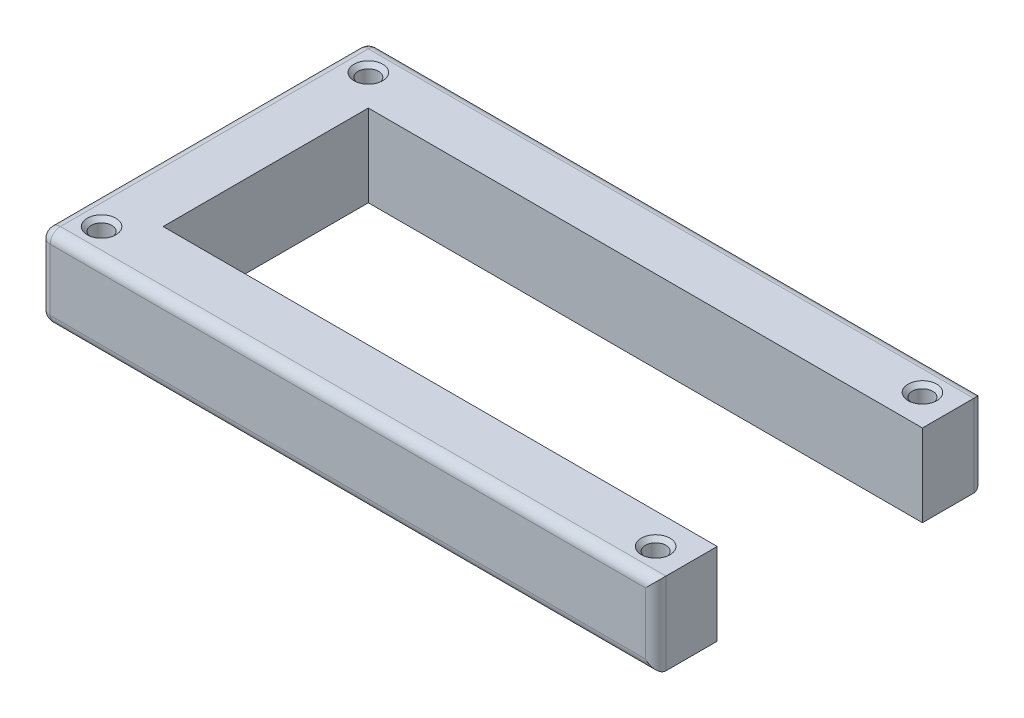
ISO-10303-21;
HEADER;
FILE_DESCRIPTION(('STEP AP214'),'2;1');
FILE_NAME('part.step','',(''),(''),'','','');
FILE_SCHEMA(('AUTOMOTIVE_DESIGN { 1 0 10303 214 1 1 1 1 }'));
ENDSEC;
DATA;
#1=APPLICATION_CONTEXT('core data for automotive mechanical design processes');
#2=APPLICATION_PROTOCOL_DEFINITION('international standard','automotive_design',2000,#1);
#3=PRODUCT_CONTEXT('',#1,'mechanical');
#4=PRODUCT('Part','Part','',(#3));
#5=PRODUCT_RELATED_PRODUCT_CATEGORY('part','',(#4));
#6=PRODUCT_DEFINITION_FORMATION('','',#4);
#7=PRODUCT_DEFINITION_CONTEXT('part definition',#1,'design');
#8=PRODUCT_DEFINITION('design','',#6,#7);
#9=PRODUCT_DEFINITION_SHAPE('','',#8);
#10=(LENGTH_UNIT() NAMED_UNIT(*) SI_UNIT(.MILLI.,.METRE.));
#11=(NAMED_UNIT(*) PLANE_ANGLE_UNIT() SI_UNIT($,.RADIAN.));
#12=(NAMED_UNIT(*) SI_UNIT($,.STERADIAN.) SOLID_ANGLE_UNIT());
#13=UNCERTAINTY_MEASURE_WITH_UNIT(LENGTH_MEASURE(1.E-05),#10,'distance_accuracy_value','');
#14=(GEOMETRIC_REPRESENTATION_CONTEXT(3) GLOBAL_UNCERTAINTY_ASSIGNED_CONTEXT((#13)) GLOBAL_UNIT_ASSIGNED_CONTEXT((#10,
#11,#12)) REPRESENTATION_CONTEXT('',''));
#15=CARTESIAN_POINT('',(0.,0.,0.));
#16=DIRECTION('',(0.,0.,1.));
#17=DIRECTION('',(1.,0.,0.));
#18=AXIS2_PLACEMENT_3D('',#15,#16,#17);
#19=CARTESIAN_POINT('',(0.,20.,0.));
#20=DIRECTION('',(0.,1.,0.));
#21=DIRECTION('',(0.,0.,1.));
#22=AXIS2_PLACEMENT_3D('',#19,#20,#21);
#23=PLANE('',#22);
#24=CARTESIAN_POINT('',(67.5,20.,-32.5));
#25=DIRECTION('',(0.,1.,0.));
#26=DIRECTION('',(0.,0.,1.));
#27=AXIS2_PLACEMENT_3D('',#24,#25,#26);
#28=CIRCLE('',#27,3.49999999999999);
#29=CARTESIAN_POINT('',(67.5,20.,-29.));
#30=VERTEX_POINT('',#29);
#31=EDGE_CURVE('E344',#30,#30,#28,.F.);
#32=ORIENTED_EDGE('',*,*,#31,.T.);
#33=EDGE_LOOP('',(#32));
#34=FACE_BOUND('',#33,.T.);
#35=CARTESIAN_POINT('',(-67.5,20.,-32.5));
#36=DIRECTION('',(0.,1.,0.));
#37=DIRECTION('',(0.,0.,1.));
#38=AXIS2_PLACEMENT_3D('',#35,#36,#37);
#39=CIRCLE('',#38,3.49999999999999);
#40=CARTESIAN_POINT('',(-67.5,20.,-29.));
#41=VERTEX_POINT('',#40);
#42=EDGE_CURVE('E340',#41,#41,#39,.F.);
#43=ORIENTED_EDGE('',*,*,#42,.T.);
#44=EDGE_LOOP('',(#43));
#45=FACE_BOUND('',#44,.T.);
#46=CARTESIAN_POINT('',(-67.5,20.,32.5));
#47=DIRECTION('',(0.,1.,0.));
#48=DIRECTION('',(0.,0.,1.));
#49=AXIS2_PLACEMENT_3D('',#46,#47,#48);
#50=CIRCLE('',#49,3.49999999999999);
#51=CARTESIAN_POINT('',(-67.5,20.,36.));
#52=VERTEX_POINT('',#51);
#53=EDGE_CURVE('E336',#52,#52,#50,.F.);
#54=ORIENTED_EDGE('',*,*,#53,.T.);
#55=EDGE_LOOP('',(#54));
#56=FACE_BOUND('',#55,.T.);
#57=CARTESIAN_POINT('',(67.5,20.,32.5));
#58=DIRECTION('',(0.,1.,0.));
#59=DIRECTION('',(0.,0.,1.));
#60=AXIS2_PLACEMENT_3D('',#57,#58,#59);
#61=CIRCLE('',#60,3.49999999999999);
#62=CARTESIAN_POINT('',(67.5,20.,36.));
#63=VERTEX_POINT('',#62);
#64=EDGE_CURVE('E332',#63,#63,#61,.F.);
#65=ORIENTED_EDGE('',*,*,#64,.T.);
#66=EDGE_LOOP('',(#65));
#67=FACE_BOUND('',#66,.T.);
#68=DIRECTION('',(0.,0.,-1.));
#69=VECTOR('',#68,1.);
#70=CARTESIAN_POINT('',(75.,20.,-25.));
#71=LINE('',#70,#69);
#72=CARTESIAN_POINT('',(75.,20.,-25.));
#73=VERTEX_POINT('',#72);
#74=CARTESIAN_POINT('',(75.,20.,-37.5));
#75=VERTEX_POINT('',#74);
#76=EDGE_CURVE('E179',#73,#75,#71,.T.);
#77=ORIENTED_EDGE('',*,*,#76,.T.);
#78=DIRECTION('',(-1.,0.,0.));
#79=VECTOR('',#78,1.);
#80=CARTESIAN_POINT('',(-75.,20.,-37.5));
#81=LINE('',#80,#79);
#82=CARTESIAN_POINT('',(-72.5,20.,-37.5));
#83=VERTEX_POINT('',#82);
#84=EDGE_CURVE('E250',#75,#83,#81,.T.);
#85=ORIENTED_EDGE('',*,*,#84,.T.);
#86=DIRECTION('',(0.,0.,1.));
#87=VECTOR('',#86,1.);
#88=CARTESIAN_POINT('',(-72.5,20.,40.));
#89=LINE('',#88,#87);
#90=CARTESIAN_POINT('',(-72.5,20.,37.5));
#91=VERTEX_POINT('',#90);
#92=EDGE_CURVE('E247',#83,#91,#89,.T.);
#93=ORIENTED_EDGE('',*,*,#92,.T.);
#94=DIRECTION('',(1.,0.,0.));
#95=VECTOR('',#94,1.);
#96=CARTESIAN_POINT('',(75.,20.,37.5));
#97=LINE('',#96,#95);
#98=CARTESIAN_POINT('',(75.,20.,37.5));
#99=VERTEX_POINT('',#98);
#100=EDGE_CURVE('E149',#91,#99,#97,.T.);
#101=ORIENTED_EDGE('',*,*,#100,.T.);
#102=DIRECTION('',(0.,0.,-1.));
#103=VECTOR('',#102,1.);
#104=CARTESIAN_POINT('',(75.,20.,40.));
#105=LINE('',#104,#103);
#106=CARTESIAN_POINT('',(75.,20.,25.));
#107=VERTEX_POINT('',#106);
#108=EDGE_CURVE('E142',#99,#107,#105,.T.);
#109=ORIENTED_EDGE('',*,*,#108,.T.);
#110=DIRECTION('',(-1.,0.,0.));
#111=VECTOR('',#110,1.);
#112=CARTESIAN_POINT('',(75.,20.,25.));
#113=LINE('',#112,#111);
#114=CARTESIAN_POINT('',(-60.,20.,25.));
#115=VERTEX_POINT('',#114);
#116=EDGE_CURVE('E146',#107,#115,#113,.T.);
#117=ORIENTED_EDGE('',*,*,#116,.T.);
#118=DIRECTION('',(0.,0.,-1.));
#119=VECTOR('',#118,1.);
#120=CARTESIAN_POINT('',(-60.,20.,-25.));
#121=LINE('',#120,#119);
#122=CARTESIAN_POINT('',(-60.,20.,-25.));
#123=VERTEX_POINT('',#122);
#124=EDGE_CURVE('E170',#115,#123,#121,.T.);
#125=ORIENTED_EDGE('',*,*,#124,.T.);
#126=DIRECTION('',(1.,0.,0.));
#127=VECTOR('',#126,1.);
#128=CARTESIAN_POINT('',(75.,20.,-25.));
#129=LINE('',#128,#127);
#130=EDGE_CURVE('E173',#123,#73,#129,.T.);
#131=ORIENTED_EDGE('',*,*,#130,.T.);
#132=EDGE_LOOP('',(#77,#85,#93,#101,#109,#117,#125,#131));
#133=FACE_BOUND('',#132,.T.);
#134=ADVANCED_FACE('F41',(#34,#45,#56,#67,#133),#23,.T.);
#135=CARTESIAN_POINT('',(0.,0.,0.));
#136=DIRECTION('',(0.,1.,0.));
#137=DIRECTION('',(0.,0.,1.));
#138=AXIS2_PLACEMENT_3D('',#135,#136,#137);
#139=PLANE('',#138);
#140=DIRECTION('',(0.,0.,1.));
#141=VECTOR('',#140,1.);
#142=CARTESIAN_POINT('',(-72.5,0.,0.));
#143=LINE('',#142,#141);
#144=CARTESIAN_POINT('',(-72.5,0.,37.5));
#145=VERTEX_POINT('',#144);
#146=CARTESIAN_POINT('',(-72.5,0.,-37.5));
#147=VERTEX_POINT('',#146);
#148=EDGE_CURVE('E236',#145,#147,#143,.F.);
#149=ORIENTED_EDGE('',*,*,#148,.T.);
#150=DIRECTION('',(-1.,0.,0.));
#151=VECTOR('',#150,1.);
#152=CARTESIAN_POINT('',(0.,0.,-37.5));
#153=LINE('',#152,#151);
#154=CARTESIAN_POINT('',(75.,0.,-37.5));
#155=VERTEX_POINT('',#154);
#156=EDGE_CURVE('E242',#147,#155,#153,.F.);
#157=ORIENTED_EDGE('',*,*,#156,.T.);
#158=DIRECTION('',(0.,0.,-1.));
#159=VECTOR('',#158,1.);
#160=CARTESIAN_POINT('',(75.,0.,-25.));
#161=LINE('',#160,#159);
#162=CARTESIAN_POINT('',(75.,0.,-25.));
#163=VERTEX_POINT('',#162);
#164=EDGE_CURVE('E153',#163,#155,#161,.T.);
#165=ORIENTED_EDGE('',*,*,#164,.F.);
#166=DIRECTION('',(1.,0.,0.));
#167=VECTOR('',#166,1.);
#168=CARTESIAN_POINT('',(75.,0.,-25.));
#169=LINE('',#168,#167);
#170=CARTESIAN_POINT('',(-60.,0.,-25.));
#171=VERTEX_POINT('',#170);
#172=EDGE_CURVE('E192',#171,#163,#169,.T.);
#173=ORIENTED_EDGE('',*,*,#172,.F.);
#174=DIRECTION('',(0.,0.,-1.));
#175=VECTOR('',#174,1.);
#176=CARTESIAN_POINT('',(-60.,0.,-25.));
#177=LINE('',#176,#175);
#178=CARTESIAN_POINT('',(-60.,0.,25.));
#179=VERTEX_POINT('',#178);
#180=EDGE_CURVE('E189',#179,#171,#177,.T.);
#181=ORIENTED_EDGE('',*,*,#180,.F.);
#182=DIRECTION('',(-1.,0.,0.));
#183=VECTOR('',#182,1.);
#184=CARTESIAN_POINT('',(75.,0.,25.));
#185=LINE('',#184,#183);
#186=CARTESIAN_POINT('',(75.,0.,25.));
#187=VERTEX_POINT('',#186);
#188=EDGE_CURVE('E185',#187,#179,#185,.T.);
#189=ORIENTED_EDGE('',*,*,#188,.F.);
#190=DIRECTION('',(0.,0.,-1.));
#191=VECTOR('',#190,1.);
#192=CARTESIAN_POINT('',(75.,0.,40.));
#193=LINE('',#192,#191);
#194=CARTESIAN_POINT('',(75.,0.,37.5));
#195=VERTEX_POINT('',#194);
#196=EDGE_CURVE('E159',#195,#187,#193,.T.);
#197=ORIENTED_EDGE('',*,*,#196,.F.);
#198=DIRECTION('',(1.,0.,0.));
#199=VECTOR('',#198,1.);
#200=CARTESIAN_POINT('',(0.,0.,37.5));
#201=LINE('',#200,#199);
#202=EDGE_CURVE('E239',#195,#145,#201,.F.);
#203=ORIENTED_EDGE('',*,*,#202,.T.);
#204=EDGE_LOOP('',(#149,#157,#165,#173,#181,#189,#197,#203));
#205=FACE_BOUND('',#204,.T.);
#206=CARTESIAN_POINT('',(-67.5,0.,-32.5));
#207=DIRECTION('',(0.,1.,0.));
#208=DIRECTION('',(0.,0.,1.));
#209=AXIS2_PLACEMENT_3D('',#206,#207,#208);
#210=CIRCLE('',#209,2.5);
#211=CARTESIAN_POINT('',(-67.5,0.,-30.));
#212=VERTEX_POINT('',#211);
#213=EDGE_CURVE('E186',#212,#212,#210,.T.);
#214=ORIENTED_EDGE('',*,*,#213,.T.);
#215=EDGE_LOOP('',(#214));
#216=FACE_BOUND('',#215,.T.);
#217=CARTESIAN_POINT('',(67.5,0.,-32.5));
#218=DIRECTION('',(0.,1.,0.));
#219=DIRECTION('',(0.,0.,1.));
#220=AXIS2_PLACEMENT_3D('',#217,#218,#219);
#221=CIRCLE('',#220,2.5);
#222=CARTESIAN_POINT('',(67.5,0.,-30.));
#223=VERTEX_POINT('',#222);
#224=EDGE_CURVE('E493',#223,#223,#221,.T.);
#225=ORIENTED_EDGE('',*,*,#224,.T.);
#226=EDGE_LOOP('',(#225));
#227=FACE_BOUND('',#226,.T.);
#228=CARTESIAN_POINT('',(67.5,0.,32.5));
#229=DIRECTION('',(0.,1.,0.));
#230=DIRECTION('',(0.,0.,1.));
#231=AXIS2_PLACEMENT_3D('',#228,#229,#230);
#232=CIRCLE('',#231,2.5);
#233=CARTESIAN_POINT('',(67.5,0.,35.));
#234=VERTEX_POINT('',#233);
#235=EDGE_CURVE('E496',#234,#234,#232,.T.);
#236=ORIENTED_EDGE('',*,*,#235,.T.);
#237=EDGE_LOOP('',(#236));
#238=FACE_BOUND('',#237,.T.);
#239=CARTESIAN_POINT('',(-67.5,0.,32.5));
#240=DIRECTION('',(0.,1.,0.));
#241=DIRECTION('',(0.,0.,1.));
#242=AXIS2_PLACEMENT_3D('',#239,#240,#241);
#243=CIRCLE('',#242,2.5);
#244=CARTESIAN_POINT('',(-67.5,0.,35.));
#245=VERTEX_POINT('',#244);
#246=EDGE_CURVE('E328',#245,#245,#243,.T.);
#247=ORIENTED_EDGE('',*,*,#246,.T.);
#248=EDGE_LOOP('',(#247));
#249=FACE_BOUND('',#248,.T.);
#250=ADVANCED_FACE('F373',(#205,#216,#227,#238,#249),#139,.F.);
#251=CARTESIAN_POINT('',(-75.,20.,40.));
#252=DIRECTION('',(1.,0.,0.));
#253=DIRECTION('',(0.,0.,-1.));
#254=AXIS2_PLACEMENT_3D('',#251,#252,#253);
#255=PLANE('',#254);
#256=DIRECTION('',(0.,0.,1.));
#257=VECTOR('',#256,1.);
#258=CARTESIAN_POINT('',(-75.,17.5,-40.));
#259=LINE('',#258,#257);
#260=CARTESIAN_POINT('',(-75.,17.5,37.5));
#261=VERTEX_POINT('',#260);
#262=CARTESIAN_POINT('',(-75.,17.5,-37.5));
#263=VERTEX_POINT('',#262);
#264=EDGE_CURVE('E223',#261,#263,#259,.F.);
#265=ORIENTED_EDGE('',*,*,#264,.T.);
#266=DIRECTION('',(0.,-1.,0.));
#267=VECTOR('',#266,1.);
#268=CARTESIAN_POINT('',(-75.,20.,-37.5));
#269=LINE('',#268,#267);
#270=CARTESIAN_POINT('',(-75.,2.5,-37.5));
#271=VERTEX_POINT('',#270);
#272=EDGE_CURVE('E232',#263,#271,#269,.T.);
#273=ORIENTED_EDGE('',*,*,#272,.T.);
#274=DIRECTION('',(0.,0.,1.));
#275=VECTOR('',#274,1.);
#276=CARTESIAN_POINT('',(-75.,2.5,40.));
#277=LINE('',#276,#275);
#278=CARTESIAN_POINT('',(-75.,2.5,37.5));
#279=VERTEX_POINT('',#278);
#280=EDGE_CURVE('E229',#271,#279,#277,.T.);
#281=ORIENTED_EDGE('',*,*,#280,.T.);
#282=DIRECTION('',(0.,-1.,0.));
#283=VECTOR('',#282,1.);
#284=CARTESIAN_POINT('',(-75.,20.,37.5));
#285=LINE('',#284,#283);
#286=EDGE_CURVE('E226',#279,#261,#285,.F.);
#287=ORIENTED_EDGE('',*,*,#286,.T.);
#288=EDGE_LOOP('',(#265,#273,#281,#287));
#289=FACE_BOUND('',#288,.T.);
#290=ADVANCED_FACE('F379',(#289),#255,.F.);
#291=CARTESIAN_POINT('',(75.,20.,40.));
#292=DIRECTION('',(0.,0.,-1.));
#293=DIRECTION('',(-1.,0.,0.));
#294=AXIS2_PLACEMENT_3D('',#291,#292,#293);
#295=PLANE('',#294);
#296=DIRECTION('',(1.,0.,0.));
#297=VECTOR('',#296,1.);
#298=CARTESIAN_POINT('',(75.,2.5,40.));
#299=LINE('',#298,#297);
#300=CARTESIAN_POINT('',(-72.5,2.5,40.));
#301=VERTEX_POINT('',#300);
#302=CARTESIAN_POINT('',(72.5,2.5,40.));
#303=VERTEX_POINT('',#302);
#304=EDGE_CURVE('E58',#301,#303,#299,.T.);
#305=ORIENTED_EDGE('',*,*,#304,.T.);
#306=DIRECTION('',(0.,-1.,0.));
#307=VECTOR('',#306,1.);
#308=CARTESIAN_POINT('',(72.5,20.,40.));
#309=LINE('',#308,#307);
#310=CARTESIAN_POINT('',(72.5,17.5,40.));
#311=VERTEX_POINT('',#310);
#312=EDGE_CURVE('E263',#303,#311,#309,.F.);
#313=ORIENTED_EDGE('',*,*,#312,.T.);
#314=DIRECTION('',(1.,0.,0.));
#315=VECTOR('',#314,1.);
#316=CARTESIAN_POINT('',(-75.,17.5,40.));
#317=LINE('',#316,#315);
#318=CARTESIAN_POINT('',(-72.5,17.5,40.));
#319=VERTEX_POINT('',#318);
#320=EDGE_CURVE('E256',#311,#319,#317,.F.);
#321=ORIENTED_EDGE('',*,*,#320,.T.);
#322=DIRECTION('',(0.,-1.,0.));
#323=VECTOR('',#322,1.);
#324=CARTESIAN_POINT('',(-72.5,20.,40.));
#325=LINE('',#324,#323);
#326=EDGE_CURVE('E63',#319,#301,#325,.T.);
#327=ORIENTED_EDGE('',*,*,#326,.T.);
#328=EDGE_LOOP('',(#305,#313,#321,#327));
#329=FACE_BOUND('',#328,.T.);
#330=ADVANCED_FACE('F407',(#329),#295,.F.);
#331=CARTESIAN_POINT('',(75.,20.,40.));
#332=DIRECTION('',(-1.,0.,0.));
#333=DIRECTION('',(0.,0.,1.));
#334=AXIS2_PLACEMENT_3D('',#331,#332,#333);
#335=PLANE('',#334);
#336=ORIENTED_EDGE('',*,*,#108,.F.);
#337=DIRECTION('',(0.,-1.,0.));
#338=VECTOR('',#337,1.);
#339=CARTESIAN_POINT('',(75.,20.,37.5));
#340=LINE('',#339,#338);
#341=EDGE_CURVE('E253',#99,#195,#340,.T.);
#342=ORIENTED_EDGE('',*,*,#341,.T.);
#343=ORIENTED_EDGE('',*,*,#196,.T.);
#344=DIRECTION('',(0.,-1.,0.));
#345=VECTOR('',#344,1.);
#346=CARTESIAN_POINT('',(75.,20.,25.));
#347=LINE('',#346,#345);
#348=EDGE_CURVE('E156',#107,#187,#347,.T.);
#349=ORIENTED_EDGE('',*,*,#348,.F.);
#350=EDGE_LOOP('',(#336,#342,#343,#349));
#351=FACE_BOUND('',#350,.T.);
#352=ADVANCED_FACE('F157',(#351),#335,.F.);
#353=CARTESIAN_POINT('',(75.,20.,25.));
#354=DIRECTION('',(0.,0.,1.));
#355=DIRECTION('',(1.,0.,0.));
#356=AXIS2_PLACEMENT_3D('',#353,#354,#355);
#357=PLANE('',#356);
#358=ORIENTED_EDGE('',*,*,#188,.T.);
#359=DIRECTION('',(0.,-1.,0.));
#360=VECTOR('',#359,1.);
#361=CARTESIAN_POINT('',(-60.,20.,25.));
#362=LINE('',#361,#360);
#363=EDGE_CURVE('E164',#115,#179,#362,.T.);
#364=ORIENTED_EDGE('',*,*,#363,.F.);
#365=ORIENTED_EDGE('',*,*,#116,.F.);
#366=ORIENTED_EDGE('',*,*,#348,.T.);
#367=EDGE_LOOP('',(#358,#364,#365,#366));
#368=FACE_BOUND('',#367,.T.);
#369=ADVANCED_FACE('F166',(#368),#357,.F.);
#370=CARTESIAN_POINT('',(-60.,20.,-25.));
#371=DIRECTION('',(-1.,0.,0.));
#372=DIRECTION('',(0.,0.,1.));
#373=AXIS2_PLACEMENT_3D('',#370,#371,#372);
#374=PLANE('',#373);
#375=ORIENTED_EDGE('',*,*,#180,.T.);
#376=DIRECTION('',(0.,-1.,0.));
#377=VECTOR('',#376,1.);
#378=CARTESIAN_POINT('',(-60.,20.,-25.));
#379=LINE('',#378,#377);
#380=EDGE_CURVE('E201',#123,#171,#379,.T.);
#381=ORIENTED_EDGE('',*,*,#380,.F.);
#382=ORIENTED_EDGE('',*,*,#124,.F.);
#383=ORIENTED_EDGE('',*,*,#363,.T.);
#384=EDGE_LOOP('',(#375,#381,#382,#383));
#385=FACE_BOUND('',#384,.T.);
#386=ADVANCED_FACE('F398',(#385),#374,.F.);
#387=CARTESIAN_POINT('',(75.,20.,-25.));
#388=DIRECTION('',(0.,0.,-1.));
#389=DIRECTION('',(-1.,0.,0.));
#390=AXIS2_PLACEMENT_3D('',#387,#388,#389);
#391=PLANE('',#390);
#392=ORIENTED_EDGE('',*,*,#172,.T.);
#393=DIRECTION('',(0.,-1.,0.));
#394=VECTOR('',#393,1.);
#395=CARTESIAN_POINT('',(75.,20.,-25.));
#396=LINE('',#395,#394);
#397=EDGE_CURVE('E182',#73,#163,#396,.T.);
#398=ORIENTED_EDGE('',*,*,#397,.F.);
#399=ORIENTED_EDGE('',*,*,#130,.F.);
#400=ORIENTED_EDGE('',*,*,#380,.T.);
#401=EDGE_LOOP('',(#392,#398,#399,#400));
#402=FACE_BOUND('',#401,.T.);
#403=ADVANCED_FACE('F394',(#402),#391,.F.);
#404=CARTESIAN_POINT('',(75.,20.,-25.));
#405=DIRECTION('',(-1.,0.,0.));
#406=DIRECTION('',(0.,0.,1.));
#407=AXIS2_PLACEMENT_3D('',#404,#405,#406);
#408=PLANE('',#407);
#409=ORIENTED_EDGE('',*,*,#164,.T.);
#410=DIRECTION('',(0.,-1.,0.));
#411=VECTOR('',#410,1.);
#412=CARTESIAN_POINT('',(75.,20.,-37.5));
#413=LINE('',#412,#411);
#414=EDGE_CURVE('E219',#155,#75,#413,.F.);
#415=ORIENTED_EDGE('',*,*,#414,.T.);
#416=ORIENTED_EDGE('',*,*,#76,.F.);
#417=ORIENTED_EDGE('',*,*,#397,.T.);
#418=EDGE_LOOP('',(#409,#415,#416,#417));
#419=FACE_BOUND('',#418,.T.);
#420=ADVANCED_FACE('F390',(#419),#408,.F.);
#421=CARTESIAN_POINT('',(75.,20.,-40.));
#422=DIRECTION('',(0.,0.,1.));
#423=DIRECTION('',(1.,0.,0.));
#424=AXIS2_PLACEMENT_3D('',#421,#422,#423);
#425=PLANE('',#424);
#426=DIRECTION('',(0.,-1.,0.));
#427=VECTOR('',#426,1.);
#428=CARTESIAN_POINT('',(72.5,20.,-40.));
#429=LINE('',#428,#427);
#430=CARTESIAN_POINT('',(72.5,17.5,-40.));
#431=VERTEX_POINT('',#430);
#432=CARTESIAN_POINT('',(72.5,2.5,-40.));
#433=VERTEX_POINT('',#432);
#434=EDGE_CURVE('E212',#431,#433,#429,.T.);
#435=ORIENTED_EDGE('',*,*,#434,.T.);
#436=DIRECTION('',(-1.,0.,0.));
#437=VECTOR('',#436,1.);
#438=CARTESIAN_POINT('',(75.,2.5,-40.));
#439=LINE('',#438,#437);
#440=CARTESIAN_POINT('',(-72.5,2.5,-40.));
#441=VERTEX_POINT('',#440);
#442=EDGE_CURVE('E216',#433,#441,#439,.T.);
#443=ORIENTED_EDGE('',*,*,#442,.T.);
#444=DIRECTION('',(0.,-1.,0.));
#445=VECTOR('',#444,1.);
#446=CARTESIAN_POINT('',(-72.5,20.,-40.));
#447=LINE('',#446,#445);
#448=CARTESIAN_POINT('',(-72.5,17.5,-40.));
#449=VERTEX_POINT('',#448);
#450=EDGE_CURVE('E209',#441,#449,#447,.F.);
#451=ORIENTED_EDGE('',*,*,#450,.T.);
#452=DIRECTION('',(-1.,0.,0.));
#453=VECTOR('',#452,1.);
#454=CARTESIAN_POINT('',(75.,17.5,-40.));
#455=LINE('',#454,#453);
#456=EDGE_CURVE('E163',#449,#431,#455,.F.);
#457=ORIENTED_EDGE('',*,*,#456,.T.);
#458=EDGE_LOOP('',(#435,#443,#451,#457));
#459=FACE_BOUND('',#458,.T.);
#460=ADVANCED_FACE('F387',(#459),#425,.F.);
#461=CARTESIAN_POINT('',(-67.5,20.,-32.5));
#462=DIRECTION('',(0.,-1.,0.));
#463=DIRECTION('',(0.,0.,-1.));
#464=AXIS2_PLACEMENT_3D('',#461,#462,#463);
#465=CYLINDRICAL_SURFACE('',#464,2.5);
#466=CARTESIAN_POINT('',(-67.5,19.,-32.5));
#467=DIRECTION('',(0.,1.,0.));
#468=DIRECTION('',(0.,0.,1.));
#469=AXIS2_PLACEMENT_3D('',#466,#467,#468);
#470=CIRCLE('',#469,2.5);
#471=CARTESIAN_POINT('',(-67.5,19.,-30.));
#472=VERTEX_POINT('',#471);
#473=EDGE_CURVE('E348',#472,#472,#470,.T.);
#474=ORIENTED_EDGE('',*,*,#473,.T.);
#475=EDGE_LOOP('',(#474));
#476=FACE_BOUND('',#475,.T.);
#477=ORIENTED_EDGE('',*,*,#213,.F.);
#478=EDGE_LOOP('',(#477));
#479=FACE_BOUND('',#478,.T.);
#480=ADVANCED_FACE('F384',(#476,#479),#465,.F.);
#481=CARTESIAN_POINT('',(67.5,20.,-32.5));
#482=DIRECTION('',(0.,-1.,0.));
#483=DIRECTION('',(0.,0.,-1.));
#484=AXIS2_PLACEMENT_3D('',#481,#482,#483);
#485=CYLINDRICAL_SURFACE('',#484,2.5);
#486=CARTESIAN_POINT('',(67.5,19.,-32.5));
#487=DIRECTION('',(0.,1.,0.));
#488=DIRECTION('',(0.,0.,1.));
#489=AXIS2_PLACEMENT_3D('',#486,#487,#488);
#490=CIRCLE('',#489,2.5);
#491=CARTESIAN_POINT('',(67.5,19.,-30.));
#492=VERTEX_POINT('',#491);
#493=EDGE_CURVE('E266',#492,#492,#490,.T.);
#494=ORIENTED_EDGE('',*,*,#493,.T.);
#495=EDGE_LOOP('',(#494));
#496=FACE_BOUND('',#495,.T.);
#497=ORIENTED_EDGE('',*,*,#224,.F.);
#498=EDGE_LOOP('',(#497));
#499=FACE_BOUND('',#498,.T.);
#500=ADVANCED_FACE('F487',(#496,#499),#485,.F.);
#501=CARTESIAN_POINT('',(67.5,20.,32.5));
#502=DIRECTION('',(0.,-1.,0.));
#503=DIRECTION('',(0.,0.,-1.));
#504=AXIS2_PLACEMENT_3D('',#501,#502,#503);
#505=CYLINDRICAL_SURFACE('',#504,2.5);
#506=CARTESIAN_POINT('',(67.5,19.,32.5));
#507=DIRECTION('',(0.,1.,0.));
#508=DIRECTION('',(0.,0.,1.));
#509=AXIS2_PLACEMENT_3D('',#506,#507,#508);
#510=CIRCLE('',#509,2.5);
#511=CARTESIAN_POINT('',(67.5,19.,35.));
#512=VERTEX_POINT('',#511);
#513=EDGE_CURVE('E11',#512,#512,#510,.T.);
#514=ORIENTED_EDGE('',*,*,#513,.T.);
#515=EDGE_LOOP('',(#514));
#516=FACE_BOUND('',#515,.T.);
#517=ORIENTED_EDGE('',*,*,#235,.F.);
#518=EDGE_LOOP('',(#517));
#519=FACE_BOUND('',#518,.T.);
#520=ADVANCED_FACE('F490',(#516,#519),#505,.F.);
#521=CARTESIAN_POINT('',(-67.5,20.,32.5));
#522=DIRECTION('',(0.,-1.,0.));
#523=DIRECTION('',(0.,0.,-1.));
#524=AXIS2_PLACEMENT_3D('',#521,#522,#523);
#525=CYLINDRICAL_SURFACE('',#524,2.5);
#526=CARTESIAN_POINT('',(-67.5,19.,32.5));
#527=DIRECTION('',(0.,1.,0.));
#528=DIRECTION('',(0.,0.,1.));
#529=AXIS2_PLACEMENT_3D('',#526,#527,#528);
#530=CIRCLE('',#529,2.5);
#531=CARTESIAN_POINT('',(-67.5,19.,35.));
#532=VERTEX_POINT('',#531);
#533=EDGE_CURVE('E51',#532,#532,#530,.T.);
#534=ORIENTED_EDGE('',*,*,#533,.T.);
#535=EDGE_LOOP('',(#534));
#536=FACE_BOUND('',#535,.T.);
#537=ORIENTED_EDGE('',*,*,#246,.F.);
#538=EDGE_LOOP('',(#537));
#539=FACE_BOUND('',#538,.T.);
#540=ADVANCED_FACE('F355',(#536,#539),#525,.F.);
#541=CARTESIAN_POINT('',(72.5,20.,37.5));
#542=DIRECTION('',(0.,-1.,0.));
#543=DIRECTION('',(0.,0.,-1.));
#544=AXIS2_PLACEMENT_3D('',#541,#542,#543);
#545=CYLINDRICAL_SURFACE('',#544,2.5);
#546=CARTESIAN_POINT('',(72.5,2.5,37.5));
#547=DIRECTION('',(0.707106781186547,0.707106781186547,0.));
#548=DIRECTION('',(0.707106781186547,-0.707106781186547,0.));
#549=AXIS2_PLACEMENT_3D('',#546,#547,#548);
#550=ELLIPSE('',#549,3.53553390593274,2.5);
#551=EDGE_CURVE('E320',#195,#303,#550,.F.);
#552=ORIENTED_EDGE('',*,*,#551,.F.);
#553=ORIENTED_EDGE('',*,*,#341,.F.);
#554=CARTESIAN_POINT('',(72.5,17.5,37.5));
#555=DIRECTION('',(-0.707106781186547,0.707106781186547,0.));
#556=DIRECTION('',(-0.707106781186547,-0.707106781186547,0.));
#557=AXIS2_PLACEMENT_3D('',#554,#555,#556);
#558=ELLIPSE('',#557,3.53553390593274,2.5);
#559=EDGE_CURVE('E324',#311,#99,#558,.T.);
#560=ORIENTED_EDGE('',*,*,#559,.F.);
#561=ORIENTED_EDGE('',*,*,#312,.F.);
#562=EDGE_LOOP('',(#552,#553,#560,#561));
#563=FACE_BOUND('',#562,.T.);
#564=ADVANCED_FACE('F464',(#563),#545,.T.);
#565=CARTESIAN_POINT('',(0.,17.5,37.5));
#566=DIRECTION('',(-1.,0.,0.));
#567=DIRECTION('',(0.,0.,1.));
#568=AXIS2_PLACEMENT_3D('',#565,#566,#567);
#569=CYLINDRICAL_SURFACE('',#568,2.5);
#570=ORIENTED_EDGE('',*,*,#559,.T.);
#571=ORIENTED_EDGE('',*,*,#100,.F.);
#572=CARTESIAN_POINT('',(-72.5,17.5,37.5));
#573=DIRECTION('',(-1.,0.,0.));
#574=DIRECTION('',(0.,0.,1.));
#575=AXIS2_PLACEMENT_3D('',#572,#573,#574);
#576=CIRCLE('',#575,2.5);
#577=EDGE_CURVE('E316',#319,#91,#576,.T.);
#578=ORIENTED_EDGE('',*,*,#577,.F.);
#579=ORIENTED_EDGE('',*,*,#320,.F.);
#580=EDGE_LOOP('',(#570,#571,#578,#579));
#581=FACE_BOUND('',#580,.T.);
#582=ADVANCED_FACE('F460',(#581),#569,.T.);
#583=CARTESIAN_POINT('',(-72.5,20.,37.5));
#584=DIRECTION('',(0.,-1.,0.));
#585=DIRECTION('',(0.,0.,-1.));
#586=AXIS2_PLACEMENT_3D('',#583,#584,#585);
#587=CYLINDRICAL_SURFACE('',#586,2.5);
#588=CARTESIAN_POINT('',(-72.5,2.5,37.5));
#589=DIRECTION('',(0.,-1.,0.));
#590=DIRECTION('',(0.,0.,-1.));
#591=AXIS2_PLACEMENT_3D('',#588,#589,#590);
#592=CIRCLE('',#591,2.5);
#593=EDGE_CURVE('E308',#301,#279,#592,.T.);
#594=ORIENTED_EDGE('',*,*,#593,.F.);
#595=ORIENTED_EDGE('',*,*,#326,.F.);
#596=CARTESIAN_POINT('',(-72.5,17.5,37.5));
#597=DIRECTION('',(0.,1.,0.));
#598=DIRECTION('',(0.,0.,1.));
#599=AXIS2_PLACEMENT_3D('',#596,#597,#598);
#600=CIRCLE('',#599,2.5);
#601=EDGE_CURVE('E312',#261,#319,#600,.T.);
#602=ORIENTED_EDGE('',*,*,#601,.F.);
#603=ORIENTED_EDGE('',*,*,#286,.F.);
#604=EDGE_LOOP('',(#594,#595,#602,#603));
#605=FACE_BOUND('',#604,.T.);
#606=ADVANCED_FACE('F456',(#605),#587,.T.);
#607=CARTESIAN_POINT('',(75.,2.5,37.5));
#608=DIRECTION('',(1.,0.,0.));
#609=DIRECTION('',(0.,0.,-1.));
#610=AXIS2_PLACEMENT_3D('',#607,#608,#609);
#611=CYLINDRICAL_SURFACE('',#610,2.5);
#612=ORIENTED_EDGE('',*,*,#551,.T.);
#613=ORIENTED_EDGE('',*,*,#304,.F.);
#614=CARTESIAN_POINT('',(-72.5,2.5,37.5));
#615=DIRECTION('',(-1.,0.,0.));
#616=DIRECTION('',(0.,0.,1.));
#617=AXIS2_PLACEMENT_3D('',#614,#615,#616);
#618=CIRCLE('',#617,2.5);
#619=EDGE_CURVE('E304',#145,#301,#618,.T.);
#620=ORIENTED_EDGE('',*,*,#619,.F.);
#621=ORIENTED_EDGE('',*,*,#202,.F.);
#622=EDGE_LOOP('',(#612,#613,#620,#621));
#623=FACE_BOUND('',#622,.T.);
#624=ADVANCED_FACE('F452',(#623),#611,.T.);
#625=CARTESIAN_POINT('',(-72.5,17.5,37.5));
#626=DIRECTION('',(0.,0.,1.));
#627=DIRECTION('',(1.,0.,0.));
#628=AXIS2_PLACEMENT_3D('',#625,#626,#627);
#629=SPHERICAL_SURFACE('',#628,2.5);
#630=ORIENTED_EDGE('',*,*,#601,.T.);
#631=ORIENTED_EDGE('',*,*,#577,.T.);
#632=CARTESIAN_POINT('',(-72.5,17.5,37.5));
#633=DIRECTION('',(0.,0.,1.));
#634=DIRECTION('',(1.,0.,0.));
#635=AXIS2_PLACEMENT_3D('',#632,#633,#634);
#636=CIRCLE('',#635,2.5);
#637=EDGE_CURVE('E300',#261,#91,#636,.F.);
#638=ORIENTED_EDGE('',*,*,#637,.F.);
#639=EDGE_LOOP('',(#630,#631,#638));
#640=FACE_BOUND('',#639,.T.);
#641=ADVANCED_FACE('F448',(#640),#629,.T.);
#642=CARTESIAN_POINT('',(-72.5,2.5,37.5));
#643=DIRECTION('',(0.,0.,1.));
#644=DIRECTION('',(0.,-1.,0.));
#645=AXIS2_PLACEMENT_3D('',#642,#643,#644);
#646=SPHERICAL_SURFACE('',#645,2.5);
#647=ORIENTED_EDGE('',*,*,#619,.T.);
#648=ORIENTED_EDGE('',*,*,#593,.T.);
#649=CARTESIAN_POINT('',(-72.5,2.5,37.5));
#650=DIRECTION('',(0.,0.,1.));
#651=DIRECTION('',(1.,0.,0.));
#652=AXIS2_PLACEMENT_3D('',#649,#650,#651);
#653=CIRCLE('',#652,2.5);
#654=EDGE_CURVE('E296',#145,#279,#653,.F.);
#655=ORIENTED_EDGE('',*,*,#654,.F.);
#656=EDGE_LOOP('',(#647,#648,#655));
#657=FACE_BOUND('',#656,.T.);
#658=ADVANCED_FACE('F444',(#657),#646,.T.);
#659=CARTESIAN_POINT('',(-72.5,17.5,0.));
#660=DIRECTION('',(0.,0.,-1.));
#661=DIRECTION('',(-1.,0.,0.));
#662=AXIS2_PLACEMENT_3D('',#659,#660,#661);
#663=CYLINDRICAL_SURFACE('',#662,2.5);
#664=ORIENTED_EDGE('',*,*,#637,.T.);
#665=ORIENTED_EDGE('',*,*,#92,.F.);
#666=CARTESIAN_POINT('',(-72.5,17.5,-37.5));
#667=DIRECTION('',(0.,0.,-1.));
#668=DIRECTION('',(-1.,0.,0.));
#669=AXIS2_PLACEMENT_3D('',#666,#667,#668);
#670=CIRCLE('',#669,2.5);
#671=EDGE_CURVE('E292',#263,#83,#670,.T.);
#672=ORIENTED_EDGE('',*,*,#671,.F.);
#673=ORIENTED_EDGE('',*,*,#264,.F.);
#674=EDGE_LOOP('',(#664,#665,#672,#673));
#675=FACE_BOUND('',#674,.T.);
#676=ADVANCED_FACE('F440',(#675),#663,.T.);
#677=CARTESIAN_POINT('',(-72.5,20.,-37.5));
#678=DIRECTION('',(0.,-1.,0.));
#679=DIRECTION('',(0.,0.,-1.));
#680=AXIS2_PLACEMENT_3D('',#677,#678,#679);
#681=CYLINDRICAL_SURFACE('',#680,2.5);
#682=CARTESIAN_POINT('',(-72.5,2.5,-37.5));
#683=DIRECTION('',(0.,-1.,0.));
#684=DIRECTION('',(0.,0.,-1.));
#685=AXIS2_PLACEMENT_3D('',#682,#683,#684);
#686=CIRCLE('',#685,2.5);
#687=EDGE_CURVE('E284',#271,#441,#686,.T.);
#688=ORIENTED_EDGE('',*,*,#687,.F.);
#689=ORIENTED_EDGE('',*,*,#272,.F.);
#690=CARTESIAN_POINT('',(-72.5,17.5,-37.5));
#691=DIRECTION('',(0.,1.,0.));
#692=DIRECTION('',(0.,0.,1.));
#693=AXIS2_PLACEMENT_3D('',#690,#691,#692);
#694=CIRCLE('',#693,2.5);
#695=EDGE_CURVE('E288',#449,#263,#694,.T.);
#696=ORIENTED_EDGE('',*,*,#695,.F.);
#697=ORIENTED_EDGE('',*,*,#450,.F.);
#698=EDGE_LOOP('',(#688,#689,#696,#697));
#699=FACE_BOUND('',#698,.T.);
#700=ADVANCED_FACE('F436',(#699),#681,.T.);
#701=CARTESIAN_POINT('',(-72.5,2.5,40.));
#702=DIRECTION('',(0.,0.,1.));
#703=DIRECTION('',(1.,0.,0.));
#704=AXIS2_PLACEMENT_3D('',#701,#702,#703);
#705=CYLINDRICAL_SURFACE('',#704,2.5);
#706=ORIENTED_EDGE('',*,*,#654,.T.);
#707=ORIENTED_EDGE('',*,*,#280,.F.);
#708=CARTESIAN_POINT('',(-72.5,2.5,-37.5));
#709=DIRECTION('',(0.,0.,-1.));
#710=DIRECTION('',(-1.,0.,0.));
#711=AXIS2_PLACEMENT_3D('',#708,#709,#710);
#712=CIRCLE('',#711,2.5);
#713=EDGE_CURVE('E281',#147,#271,#712,.T.);
#714=ORIENTED_EDGE('',*,*,#713,.F.);
#715=ORIENTED_EDGE('',*,*,#148,.F.);
#716=EDGE_LOOP('',(#706,#707,#714,#715));
#717=FACE_BOUND('',#716,.T.);
#718=ADVANCED_FACE('F432',(#717),#705,.T.);
#719=CARTESIAN_POINT('',(-72.5,17.5,-37.5));
#720=DIRECTION('',(-1.,0.,0.));
#721=DIRECTION('',(0.,0.,1.));
#722=AXIS2_PLACEMENT_3D('',#719,#720,#721);
#723=SPHERICAL_SURFACE('',#722,2.5);
#724=ORIENTED_EDGE('',*,*,#695,.T.);
#725=ORIENTED_EDGE('',*,*,#671,.T.);
#726=CARTESIAN_POINT('',(-72.5,17.5,-37.5));
#727=DIRECTION('',(-1.,0.,0.));
#728=DIRECTION('',(0.,0.,1.));
#729=AXIS2_PLACEMENT_3D('',#726,#727,#728);
#730=CIRCLE('',#729,2.5);
#731=EDGE_CURVE('E277',#449,#83,#730,.F.);
#732=ORIENTED_EDGE('',*,*,#731,.F.);
#733=EDGE_LOOP('',(#724,#725,#732));
#734=FACE_BOUND('',#733,.T.);
#735=ADVANCED_FACE('F428',(#734),#723,.T.);
#736=CARTESIAN_POINT('',(-72.5,2.5,-37.5));
#737=DIRECTION('',(-1.,0.,0.));
#738=DIRECTION('',(0.,-1.,0.));
#739=AXIS2_PLACEMENT_3D('',#736,#737,#738);
#740=SPHERICAL_SURFACE('',#739,2.5);
#741=ORIENTED_EDGE('',*,*,#713,.T.);
#742=ORIENTED_EDGE('',*,*,#687,.T.);
#743=CARTESIAN_POINT('',(-72.5,2.5,-37.5));
#744=DIRECTION('',(-1.,0.,0.));
#745=DIRECTION('',(0.,0.,1.));
#746=AXIS2_PLACEMENT_3D('',#743,#744,#745);
#747=CIRCLE('',#746,2.5);
#748=EDGE_CURVE('E273',#147,#441,#747,.F.);
#749=ORIENTED_EDGE('',*,*,#748,.F.);
#750=EDGE_LOOP('',(#741,#742,#749));
#751=FACE_BOUND('',#750,.T.);
#752=ADVANCED_FACE('F424',(#751),#740,.T.);
#753=CARTESIAN_POINT('',(0.,17.5,-37.5));
#754=DIRECTION('',(1.,0.,0.));
#755=DIRECTION('',(0.,0.,-1.));
#756=AXIS2_PLACEMENT_3D('',#753,#754,#755);
#757=CYLINDRICAL_SURFACE('',#756,2.5);
#758=ORIENTED_EDGE('',*,*,#731,.T.);
#759=ORIENTED_EDGE('',*,*,#84,.F.);
#760=CARTESIAN_POINT('',(72.5,17.5,-37.5));
#761=DIRECTION('',(0.707106781186547,-0.707106781186547,0.));
#762=DIRECTION('',(0.707106781186547,0.707106781186547,0.));
#763=AXIS2_PLACEMENT_3D('',#760,#761,#762);
#764=ELLIPSE('',#763,3.53553390593274,2.5);
#765=EDGE_CURVE('E270',#431,#75,#764,.T.);
#766=ORIENTED_EDGE('',*,*,#765,.F.);
#767=ORIENTED_EDGE('',*,*,#456,.F.);
#768=EDGE_LOOP('',(#758,#759,#766,#767));
#769=FACE_BOUND('',#768,.T.);
#770=ADVANCED_FACE('F420',(#769),#757,.T.);
#771=CARTESIAN_POINT('',(75.,2.5,-37.5));
#772=DIRECTION('',(-1.,0.,0.));
#773=DIRECTION('',(0.,0.,1.));
#774=AXIS2_PLACEMENT_3D('',#771,#772,#773);
#775=CYLINDRICAL_SURFACE('',#774,2.5);
#776=ORIENTED_EDGE('',*,*,#748,.T.);
#777=ORIENTED_EDGE('',*,*,#442,.F.);
#778=CARTESIAN_POINT('',(72.5,2.5,-37.5));
#779=DIRECTION('',(-0.707106781186547,-0.707106781186547,0.));
#780=DIRECTION('',(-0.707106781186547,0.707106781186547,0.));
#781=AXIS2_PLACEMENT_3D('',#778,#779,#780);
#782=ELLIPSE('',#781,3.53553390593274,2.5);
#783=EDGE_CURVE('E267',#155,#433,#782,.F.);
#784=ORIENTED_EDGE('',*,*,#783,.F.);
#785=ORIENTED_EDGE('',*,*,#156,.F.);
#786=EDGE_LOOP('',(#776,#777,#784,#785));
#787=FACE_BOUND('',#786,.T.);
#788=ADVANCED_FACE('F416',(#787),#775,.T.);
#789=CARTESIAN_POINT('',(72.5,20.,-37.5));
#790=DIRECTION('',(0.,-1.,0.));
#791=DIRECTION('',(0.,0.,-1.));
#792=AXIS2_PLACEMENT_3D('',#789,#790,#791);
#793=CYLINDRICAL_SURFACE('',#792,2.5);
#794=ORIENTED_EDGE('',*,*,#765,.T.);
#795=ORIENTED_EDGE('',*,*,#414,.F.);
#796=ORIENTED_EDGE('',*,*,#783,.T.);
#797=ORIENTED_EDGE('',*,*,#434,.F.);
#798=EDGE_LOOP('',(#794,#795,#796,#797));
#799=FACE_BOUND('',#798,.T.);
#800=ADVANCED_FACE('F413',(#799),#793,.T.);
#801=CARTESIAN_POINT('',(67.5,19.,-32.5));
#802=DIRECTION('',(0.,1.,0.));
#803=DIRECTION('',(0.,0.,1.));
#804=AXIS2_PLACEMENT_3D('',#801,#802,#803);
#805=CONICAL_SURFACE('',#804,2.5,0.785398163397452);
#806=ORIENTED_EDGE('',*,*,#31,.F.);
#807=EDGE_LOOP('',(#806));
#808=FACE_BOUND('',#807,.T.);
#809=ORIENTED_EDGE('',*,*,#493,.F.);
#810=EDGE_LOOP('',(#809));
#811=FACE_BOUND('',#810,.T.);
#812=ADVANCED_FACE('F367',(#808,#811),#805,.F.);
#813=CARTESIAN_POINT('',(-67.5,19.,-32.5));
#814=DIRECTION('',(0.,1.,0.));
#815=DIRECTION('',(0.,0.,1.));
#816=AXIS2_PLACEMENT_3D('',#813,#814,#815);
#817=CONICAL_SURFACE('',#816,2.5,0.785398163397452);
#818=ORIENTED_EDGE('',*,*,#42,.F.);
#819=EDGE_LOOP('',(#818));
#820=FACE_BOUND('',#819,.T.);
#821=ORIENTED_EDGE('',*,*,#473,.F.);
#822=EDGE_LOOP('',(#821));
#823=FACE_BOUND('',#822,.T.);
#824=ADVANCED_FACE('F360',(#820,#823),#817,.F.);
#825=CARTESIAN_POINT('',(-67.5,19.,32.5));
#826=DIRECTION('',(0.,1.,0.));
#827=DIRECTION('',(0.,0.,1.));
#828=AXIS2_PLACEMENT_3D('',#825,#826,#827);
#829=CONICAL_SURFACE('',#828,2.5,0.785398163397452);
#830=ORIENTED_EDGE('',*,*,#53,.F.);
#831=EDGE_LOOP('',(#830));
#832=FACE_BOUND('',#831,.T.);
#833=ORIENTED_EDGE('',*,*,#533,.F.);
#834=EDGE_LOOP('',(#833));
#835=FACE_BOUND('',#834,.T.);
#836=ADVANCED_FACE('F358',(#832,#835),#829,.F.);
#837=CARTESIAN_POINT('',(67.5,19.,32.5));
#838=DIRECTION('',(0.,1.,0.));
#839=DIRECTION('',(0.,0.,1.));
#840=AXIS2_PLACEMENT_3D('',#837,#838,#839);
#841=CONICAL_SURFACE('',#840,2.5,0.785398163397452);
#842=ORIENTED_EDGE('',*,*,#64,.F.);
#843=EDGE_LOOP('',(#842));
#844=FACE_BOUND('',#843,.T.);
#845=ORIENTED_EDGE('',*,*,#513,.F.);
#846=EDGE_LOOP('',(#845));
#847=FACE_BOUND('',#846,.T.);
#848=ADVANCED_FACE('F44',(#844,#847),#841,.F.);
#849=CLOSED_SHELL('',(#134,#250,#290,#330,#352,#369,#386,#403,#420,#460,#480,#500,#520,#540,
#564,#582,#606,#624,#641,#658,#676,#700,#718,#735,#752,#770,#788,#800,#812,#824,#836,#848));
#850=MANIFOLD_SOLID_BREP('B2',#849);
#851=ADVANCED_BREP_SHAPE_REPRESENTATION('',(#18,#850),#14);
#852=SHAPE_DEFINITION_REPRESENTATION(#9,#851);
ENDSEC;
END-ISO-10303-21;
